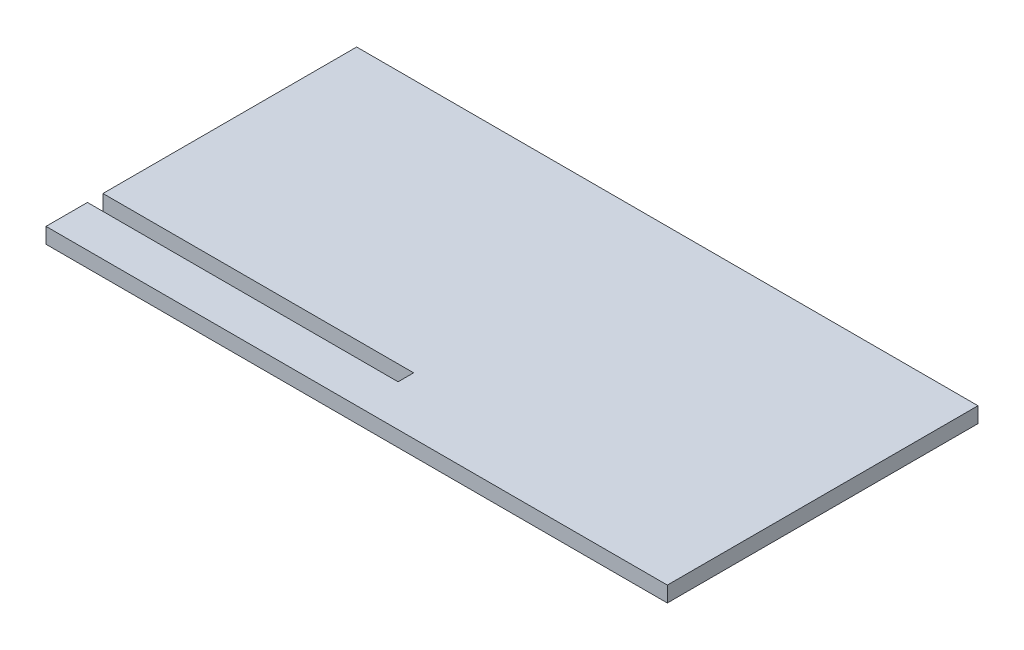
ISO-10303-21;
HEADER;
FILE_DESCRIPTION(('STEP AP214'),'2;1');
FILE_NAME('part.step','',(''),(''),'','','');
FILE_SCHEMA(('AUTOMOTIVE_DESIGN { 1 0 10303 214 1 1 1 1 }'));
ENDSEC;
DATA;
#1=APPLICATION_CONTEXT('core data for automotive mechanical design processes');
#2=APPLICATION_PROTOCOL_DEFINITION('international standard','automotive_design',2000,#1);
#3=PRODUCT_CONTEXT('',#1,'mechanical');
#4=PRODUCT('Part','Part','',(#3));
#5=PRODUCT_RELATED_PRODUCT_CATEGORY('part','',(#4));
#6=PRODUCT_DEFINITION_FORMATION('','',#4);
#7=PRODUCT_DEFINITION_CONTEXT('part definition',#1,'design');
#8=PRODUCT_DEFINITION('design','',#6,#7);
#9=PRODUCT_DEFINITION_SHAPE('','',#8);
#10=(LENGTH_UNIT() NAMED_UNIT(*) SI_UNIT(.MILLI.,.METRE.));
#11=(NAMED_UNIT(*) PLANE_ANGLE_UNIT() SI_UNIT($,.RADIAN.));
#12=(NAMED_UNIT(*) SI_UNIT($,.STERADIAN.) SOLID_ANGLE_UNIT());
#13=UNCERTAINTY_MEASURE_WITH_UNIT(LENGTH_MEASURE(1.E-05),#10,'distance_accuracy_value','');
#14=(GEOMETRIC_REPRESENTATION_CONTEXT(3) GLOBAL_UNCERTAINTY_ASSIGNED_CONTEXT((#13)) GLOBAL_UNIT_ASSIGNED_CONTEXT((#10,
#11,#12)) REPRESENTATION_CONTEXT('',''));
#15=CARTESIAN_POINT('',(0.,0.,0.));
#16=DIRECTION('',(0.,0.,1.));
#17=DIRECTION('',(1.,0.,0.));
#18=AXIS2_PLACEMENT_3D('',#15,#16,#17);
#19=CARTESIAN_POINT('',(0.,3.,0.));
#20=DIRECTION('',(1.,0.,0.));
#21=DIRECTION('',(0.,0.,-1.));
#22=AXIS2_PLACEMENT_3D('',#19,#20,#21);
#23=PLANE('',#22);
#24=DIRECTION('',(0.,0.,1.));
#25=VECTOR('',#24,1.);
#26=CARTESIAN_POINT('',(0.,0.,0.));
#27=LINE('',#26,#25);
#28=CARTESIAN_POINT('',(0.,0.,9.));
#29=VERTEX_POINT('',#28);
#30=CARTESIAN_POINT('',(0.,0.,12.));
#31=VERTEX_POINT('',#30);
#32=EDGE_CURVE('E161',#29,#31,#27,.T.);
#33=ORIENTED_EDGE('',*,*,#32,.T.);
#34=DIRECTION('',(0.,-1.,0.));
#35=VECTOR('',#34,1.);
#36=CARTESIAN_POINT('',(0.,3.,12.));
#37=LINE('',#36,#35);
#38=CARTESIAN_POINT('',(0.,3.,12.));
#39=VERTEX_POINT('',#38);
#40=EDGE_CURVE('E12',#39,#31,#37,.T.);
#41=ORIENTED_EDGE('',*,*,#40,.F.);
#42=DIRECTION('',(0.,0.,1.));
#43=VECTOR('',#42,1.);
#44=CARTESIAN_POINT('',(0.,3.,0.));
#45=LINE('',#44,#43);
#46=CARTESIAN_POINT('',(0.,3.,9.));
#47=VERTEX_POINT('',#46);
#48=EDGE_CURVE('E143',#47,#39,#45,.T.);
#49=ORIENTED_EDGE('',*,*,#48,.F.);
#50=DIRECTION('',(0.,-1.,0.));
#51=VECTOR('',#50,1.);
#52=CARTESIAN_POINT('',(0.,3.,9.));
#53=LINE('',#52,#51);
#54=EDGE_CURVE('E132',#47,#29,#53,.T.);
#55=ORIENTED_EDGE('',*,*,#54,.T.);
#56=EDGE_LOOP('',(#33,#41,#49,#55));
#57=FACE_BOUND('',#56,.T.);
#58=ADVANCED_FACE('F38',(#57),#23,.F.);
#59=CARTESIAN_POINT('',(0.,3.,12.));
#60=DIRECTION('',(0.,0.,1.));
#61=DIRECTION('',(1.,0.,0.));
#62=AXIS2_PLACEMENT_3D('',#59,#60,#61);
#63=PLANE('',#62);
#64=DIRECTION('',(-1.,0.,0.));
#65=VECTOR('',#64,1.);
#66=CARTESIAN_POINT('',(0.,0.,12.));
#67=LINE('',#66,#65);
#68=CARTESIAN_POINT('',(-60.,0.,12.));
#69=VERTEX_POINT('',#68);
#70=EDGE_CURVE('E164',#31,#69,#67,.T.);
#71=ORIENTED_EDGE('',*,*,#70,.T.);
#72=DIRECTION('',(0.,-1.,0.));
#73=VECTOR('',#72,1.);
#74=CARTESIAN_POINT('',(-60.,3.,12.));
#75=LINE('',#74,#73);
#76=CARTESIAN_POINT('',(-60.,3.,12.));
#77=VERTEX_POINT('',#76);
#78=EDGE_CURVE('E46',#77,#69,#75,.T.);
#79=ORIENTED_EDGE('',*,*,#78,.F.);
#80=DIRECTION('',(-1.,0.,0.));
#81=VECTOR('',#80,1.);
#82=CARTESIAN_POINT('',(0.,3.,12.));
#83=LINE('',#82,#81);
#84=EDGE_CURVE('E93',#39,#77,#83,.T.);
#85=ORIENTED_EDGE('',*,*,#84,.F.);
#86=ORIENTED_EDGE('',*,*,#40,.T.);
#87=EDGE_LOOP('',(#71,#79,#85,#86));
#88=FACE_BOUND('',#87,.T.);
#89=ADVANCED_FACE('F187',(#88),#63,.F.);
#90=CARTESIAN_POINT('',(-60.,3.,0.));
#91=DIRECTION('',(-1.,0.,0.));
#92=DIRECTION('',(0.,0.,1.));
#93=AXIS2_PLACEMENT_3D('',#90,#91,#92);
#94=PLANE('',#93);
#95=DIRECTION('',(0.,0.,-1.));
#96=VECTOR('',#95,1.);
#97=CARTESIAN_POINT('',(-60.,0.,0.));
#98=LINE('',#97,#96);
#99=CARTESIAN_POINT('',(-60.,0.,20.));
#100=VERTEX_POINT('',#99);
#101=EDGE_CURVE('E167',#100,#69,#98,.T.);
#102=ORIENTED_EDGE('',*,*,#101,.F.);
#103=DIRECTION('',(0.,-1.,0.));
#104=VECTOR('',#103,1.);
#105=CARTESIAN_POINT('',(-60.,3.,20.));
#106=LINE('',#105,#104);
#107=CARTESIAN_POINT('',(-60.,3.,20.));
#108=VERTEX_POINT('',#107);
#109=EDGE_CURVE('E184',#108,#100,#106,.T.);
#110=ORIENTED_EDGE('',*,*,#109,.F.);
#111=DIRECTION('',(0.,0.,-1.));
#112=VECTOR('',#111,1.);
#113=CARTESIAN_POINT('',(-60.,3.,0.));
#114=LINE('',#113,#112);
#115=EDGE_CURVE('E130',#108,#77,#114,.T.);
#116=ORIENTED_EDGE('',*,*,#115,.T.);
#117=ORIENTED_EDGE('',*,*,#78,.T.);
#118=EDGE_LOOP('',(#102,#110,#116,#117));
#119=FACE_BOUND('',#118,.T.);
#120=ADVANCED_FACE('F186',(#119),#94,.T.);
#121=CARTESIAN_POINT('',(0.,3.,20.));
#122=DIRECTION('',(0.,0.,-1.));
#123=DIRECTION('',(-1.,0.,0.));
#124=AXIS2_PLACEMENT_3D('',#121,#122,#123);
#125=PLANE('',#124);
#126=DIRECTION('',(1.,0.,0.));
#127=VECTOR('',#126,1.);
#128=CARTESIAN_POINT('',(0.,0.,20.));
#129=LINE('',#128,#127);
#130=CARTESIAN_POINT('',(60.,0.,20.));
#131=VERTEX_POINT('',#130);
#132=EDGE_CURVE('E170',#100,#131,#129,.T.);
#133=ORIENTED_EDGE('',*,*,#132,.T.);
#134=DIRECTION('',(0.,-1.,0.));
#135=VECTOR('',#134,1.);
#136=CARTESIAN_POINT('',(60.,3.,20.));
#137=LINE('',#136,#135);
#138=CARTESIAN_POINT('',(60.,3.,20.));
#139=VERTEX_POINT('',#138);
#140=EDGE_CURVE('E181',#139,#131,#137,.T.);
#141=ORIENTED_EDGE('',*,*,#140,.F.);
#142=DIRECTION('',(1.,0.,0.));
#143=VECTOR('',#142,1.);
#144=CARTESIAN_POINT('',(0.,3.,20.));
#145=LINE('',#144,#143);
#146=EDGE_CURVE('E138',#108,#139,#145,.T.);
#147=ORIENTED_EDGE('',*,*,#146,.F.);
#148=ORIENTED_EDGE('',*,*,#109,.T.);
#149=EDGE_LOOP('',(#133,#141,#147,#148));
#150=FACE_BOUND('',#149,.T.);
#151=ADVANCED_FACE('F196',(#150),#125,.F.);
#152=CARTESIAN_POINT('',(60.,3.,0.));
#153=DIRECTION('',(-1.,0.,0.));
#154=DIRECTION('',(0.,0.,1.));
#155=AXIS2_PLACEMENT_3D('',#152,#153,#154);
#156=PLANE('',#155);
#157=DIRECTION('',(0.,0.,-1.));
#158=VECTOR('',#157,1.);
#159=CARTESIAN_POINT('',(60.,0.,0.));
#160=LINE('',#159,#158);
#161=CARTESIAN_POINT('',(60.,0.,-40.));
#162=VERTEX_POINT('',#161);
#163=EDGE_CURVE('E173',#131,#162,#160,.T.);
#164=ORIENTED_EDGE('',*,*,#163,.T.);
#165=DIRECTION('',(0.,-1.,0.));
#166=VECTOR('',#165,1.);
#167=CARTESIAN_POINT('',(60.,3.,-40.));
#168=LINE('',#167,#166);
#169=CARTESIAN_POINT('',(60.,3.,-40.));
#170=VERTEX_POINT('',#169);
#171=EDGE_CURVE('E118',#170,#162,#168,.T.);
#172=ORIENTED_EDGE('',*,*,#171,.F.);
#173=DIRECTION('',(0.,0.,-1.));
#174=VECTOR('',#173,1.);
#175=CARTESIAN_POINT('',(60.,3.,0.));
#176=LINE('',#175,#174);
#177=EDGE_CURVE('E123',#139,#170,#176,.T.);
#178=ORIENTED_EDGE('',*,*,#177,.F.);
#179=ORIENTED_EDGE('',*,*,#140,.T.);
#180=EDGE_LOOP('',(#164,#172,#178,#179));
#181=FACE_BOUND('',#180,.T.);
#182=ADVANCED_FACE('F199',(#181),#156,.F.);
#183=CARTESIAN_POINT('',(0.,3.,-40.));
#184=DIRECTION('',(0.,0.,-1.));
#185=DIRECTION('',(-1.,0.,0.));
#186=AXIS2_PLACEMENT_3D('',#183,#184,#185);
#187=PLANE('',#186);
#188=DIRECTION('',(1.,0.,0.));
#189=VECTOR('',#188,1.);
#190=CARTESIAN_POINT('',(0.,0.,-40.));
#191=LINE('',#190,#189);
#192=CARTESIAN_POINT('',(-60.,0.,-40.));
#193=VERTEX_POINT('',#192);
#194=EDGE_CURVE('E113',#193,#162,#191,.T.);
#195=ORIENTED_EDGE('',*,*,#194,.F.);
#196=DIRECTION('',(0.,-1.,0.));
#197=VECTOR('',#196,1.);
#198=CARTESIAN_POINT('',(-60.,3.,-40.));
#199=LINE('',#198,#197);
#200=CARTESIAN_POINT('',(-60.,3.,-40.));
#201=VERTEX_POINT('',#200);
#202=EDGE_CURVE('E108',#201,#193,#199,.T.);
#203=ORIENTED_EDGE('',*,*,#202,.F.);
#204=DIRECTION('',(1.,0.,0.));
#205=VECTOR('',#204,1.);
#206=CARTESIAN_POINT('',(0.,3.,-40.));
#207=LINE('',#206,#205);
#208=EDGE_CURVE('E111',#201,#170,#207,.T.);
#209=ORIENTED_EDGE('',*,*,#208,.T.);
#210=ORIENTED_EDGE('',*,*,#171,.T.);
#211=EDGE_LOOP('',(#195,#203,#209,#210));
#212=FACE_BOUND('',#211,.T.);
#213=ADVANCED_FACE('F110',(#212),#187,.T.);
#214=CARTESIAN_POINT('',(-60.,0.,9.));
#215=VERTEX_POINT('',#214);
#216=EDGE_CURVE('E171',#215,#193,#98,.T.);
#217=ORIENTED_EDGE('',*,*,#216,.F.);
#218=DIRECTION('',(0.,-1.,0.));
#219=VECTOR('',#218,1.);
#220=CARTESIAN_POINT('',(-60.,3.,9.));
#221=LINE('',#220,#219);
#222=CARTESIAN_POINT('',(-60.,3.,9.));
#223=VERTEX_POINT('',#222);
#224=EDGE_CURVE('E82',#223,#215,#221,.T.);
#225=ORIENTED_EDGE('',*,*,#224,.F.);
#226=EDGE_CURVE('E121',#223,#201,#114,.T.);
#227=ORIENTED_EDGE('',*,*,#226,.T.);
#228=ORIENTED_EDGE('',*,*,#202,.T.);
#229=EDGE_LOOP('',(#217,#225,#227,#228));
#230=FACE_BOUND('',#229,.T.);
#231=ADVANCED_FACE('F127',(#230),#94,.T.);
#232=CARTESIAN_POINT('',(0.,3.,9.));
#233=DIRECTION('',(0.,0.,-1.));
#234=DIRECTION('',(-1.,0.,0.));
#235=AXIS2_PLACEMENT_3D('',#232,#233,#234);
#236=PLANE('',#235);
#237=DIRECTION('',(1.,0.,0.));
#238=VECTOR('',#237,1.);
#239=CARTESIAN_POINT('',(0.,0.,9.));
#240=LINE('',#239,#238);
#241=EDGE_CURVE('E85',#215,#29,#240,.T.);
#242=ORIENTED_EDGE('',*,*,#241,.T.);
#243=ORIENTED_EDGE('',*,*,#54,.F.);
#244=DIRECTION('',(1.,0.,0.));
#245=VECTOR('',#244,1.);
#246=CARTESIAN_POINT('',(0.,3.,9.));
#247=LINE('',#246,#245);
#248=EDGE_CURVE('E54',#223,#47,#247,.T.);
#249=ORIENTED_EDGE('',*,*,#248,.F.);
#250=ORIENTED_EDGE('',*,*,#224,.T.);
#251=EDGE_LOOP('',(#242,#243,#249,#250));
#252=FACE_BOUND('',#251,.T.);
#253=ADVANCED_FACE('F202',(#252),#236,.F.);
#254=CARTESIAN_POINT('',(0.,3.,0.));
#255=DIRECTION('',(0.,1.,0.));
#256=DIRECTION('',(0.,0.,1.));
#257=AXIS2_PLACEMENT_3D('',#254,#255,#256);
#258=PLANE('',#257);
#259=ORIENTED_EDGE('',*,*,#48,.T.);
#260=ORIENTED_EDGE('',*,*,#84,.T.);
#261=ORIENTED_EDGE('',*,*,#115,.F.);
#262=ORIENTED_EDGE('',*,*,#146,.T.);
#263=ORIENTED_EDGE('',*,*,#177,.T.);
#264=ORIENTED_EDGE('',*,*,#208,.F.);
#265=ORIENTED_EDGE('',*,*,#226,.F.);
#266=ORIENTED_EDGE('',*,*,#248,.T.);
#267=EDGE_LOOP('',(#259,#260,#261,#262,#263,#264,#265,#266));
#268=FACE_BOUND('',#267,.T.);
#269=ADVANCED_FACE('F120',(#268),#258,.T.);
#270=CARTESIAN_POINT('',(0.,0.,0.));
#271=DIRECTION('',(0.,1.,0.));
#272=DIRECTION('',(0.,0.,1.));
#273=AXIS2_PLACEMENT_3D('',#270,#271,#272);
#274=PLANE('',#273);
#275=ORIENTED_EDGE('',*,*,#32,.F.);
#276=ORIENTED_EDGE('',*,*,#241,.F.);
#277=ORIENTED_EDGE('',*,*,#216,.T.);
#278=ORIENTED_EDGE('',*,*,#194,.T.);
#279=ORIENTED_EDGE('',*,*,#163,.F.);
#280=ORIENTED_EDGE('',*,*,#132,.F.);
#281=ORIENTED_EDGE('',*,*,#101,.T.);
#282=ORIENTED_EDGE('',*,*,#70,.F.);
#283=EDGE_LOOP('',(#275,#276,#277,#278,#279,#280,#281,#282));
#284=FACE_BOUND('',#283,.T.);
#285=ADVANCED_FACE('F192',(#284),#274,.F.);
#286=CLOSED_SHELL('',(#58,#89,#120,#151,#182,#213,#231,#253,#269,#285));
#287=MANIFOLD_SOLID_BREP('B2',#286);
#288=ADVANCED_BREP_SHAPE_REPRESENTATION('',(#18,#287),#14);
#289=SHAPE_DEFINITION_REPRESENTATION(#9,#288);
ENDSEC;
END-ISO-10303-21;
